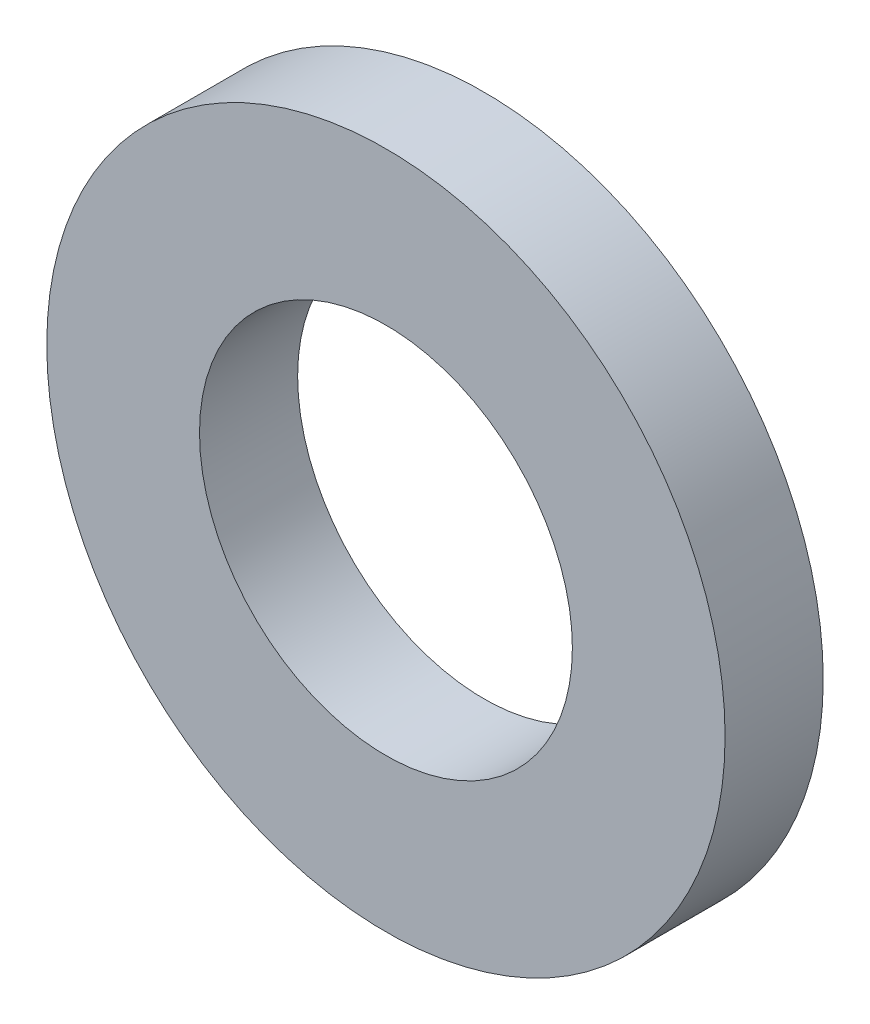
ISO-10303-21;
HEADER;
FILE_DESCRIPTION(('STEP AP214'),'2;1');
FILE_NAME('part.step','',(''),(''),'','','');
FILE_SCHEMA(('AUTOMOTIVE_DESIGN { 1 0 10303 214 1 1 1 1 }'));
ENDSEC;
DATA;
#1=APPLICATION_CONTEXT('core data for automotive mechanical design processes');
#2=APPLICATION_PROTOCOL_DEFINITION('international standard','automotive_design',2000,#1);
#3=PRODUCT_CONTEXT('',#1,'mechanical');
#4=PRODUCT('Part','Part','',(#3));
#5=PRODUCT_RELATED_PRODUCT_CATEGORY('part','',(#4));
#6=PRODUCT_DEFINITION_FORMATION('','',#4);
#7=PRODUCT_DEFINITION_CONTEXT('part definition',#1,'design');
#8=PRODUCT_DEFINITION('design','',#6,#7);
#9=PRODUCT_DEFINITION_SHAPE('','',#8);
#10=(LENGTH_UNIT() NAMED_UNIT(*) SI_UNIT(.MILLI.,.METRE.));
#11=(NAMED_UNIT(*) PLANE_ANGLE_UNIT() SI_UNIT($,.RADIAN.));
#12=(NAMED_UNIT(*) SI_UNIT($,.STERADIAN.) SOLID_ANGLE_UNIT());
#13=UNCERTAINTY_MEASURE_WITH_UNIT(LENGTH_MEASURE(1.E-05),#10,'distance_accuracy_value','');
#14=(GEOMETRIC_REPRESENTATION_CONTEXT(3) GLOBAL_UNCERTAINTY_ASSIGNED_CONTEXT((#13)) GLOBAL_UNIT_ASSIGNED_CONTEXT((#10,
#11,#12)) REPRESENTATION_CONTEXT('',''));
#15=CARTESIAN_POINT('',(0.,0.,0.));
#16=DIRECTION('',(0.,0.,1.));
#17=DIRECTION('',(1.,0.,0.));
#18=AXIS2_PLACEMENT_3D('',#15,#16,#17);
#19=CARTESIAN_POINT('',(0.,0.,1.));
#20=DIRECTION('',(0.,0.,1.));
#21=DIRECTION('',(1.,0.,0.));
#22=AXIS2_PLACEMENT_3D('',#19,#20,#21);
#23=PLANE('',#22);
#24=CARTESIAN_POINT('',(0.,0.,1.));
#25=DIRECTION('',(0.,0.,1.));
#26=DIRECTION('',(1.,0.,0.));
#27=AXIS2_PLACEMENT_3D('',#24,#25,#26);
#28=CIRCLE('',#27,3.45648215711929);
#29=CARTESIAN_POINT('',(3.45648215711929,0.,1.));
#30=VERTEX_POINT('',#29);
#31=EDGE_CURVE('E10',#30,#30,#28,.T.);
#32=ORIENTED_EDGE('',*,*,#31,.T.);
#33=EDGE_LOOP('',(#32));
#34=FACE_BOUND('',#33,.T.);
#35=CARTESIAN_POINT('',(0.,0.,1.));
#36=DIRECTION('',(0.,0.,1.));
#37=DIRECTION('',(1.,0.,0.));
#38=AXIS2_PLACEMENT_3D('',#35,#36,#37);
#39=CIRCLE('',#38,1.9);
#40=CARTESIAN_POINT('',(1.9,0.,1.));
#41=VERTEX_POINT('',#40);
#42=EDGE_CURVE('E46',#41,#41,#39,.T.);
#43=ORIENTED_EDGE('',*,*,#42,.F.);
#44=EDGE_LOOP('',(#43));
#45=FACE_BOUND('',#44,.T.);
#46=ADVANCED_FACE('F35',(#34,#45),#23,.T.);
#47=CARTESIAN_POINT('',(0.,0.,0.));
#48=DIRECTION('',(0.,0.,1.));
#49=DIRECTION('',(1.,0.,0.));
#50=AXIS2_PLACEMENT_3D('',#47,#48,#49);
#51=PLANE('',#50);
#52=CARTESIAN_POINT('',(0.,0.,0.));
#53=DIRECTION('',(0.,0.,1.));
#54=DIRECTION('',(1.,0.,0.));
#55=AXIS2_PLACEMENT_3D('',#52,#53,#54);
#56=CIRCLE('',#55,3.45648215711929);
#57=CARTESIAN_POINT('',(3.45648215711929,0.,0.));
#58=VERTEX_POINT('',#57);
#59=EDGE_CURVE('E39',#58,#58,#56,.T.);
#60=ORIENTED_EDGE('',*,*,#59,.F.);
#61=EDGE_LOOP('',(#60));
#62=FACE_BOUND('',#61,.T.);
#63=CARTESIAN_POINT('',(0.,0.,0.));
#64=DIRECTION('',(0.,0.,1.));
#65=DIRECTION('',(1.,0.,0.));
#66=AXIS2_PLACEMENT_3D('',#63,#64,#65);
#67=CIRCLE('',#66,1.9);
#68=CARTESIAN_POINT('',(1.9,0.,0.));
#69=VERTEX_POINT('',#68);
#70=EDGE_CURVE('E48',#69,#69,#67,.T.);
#71=ORIENTED_EDGE('',*,*,#70,.T.);
#72=EDGE_LOOP('',(#71));
#73=FACE_BOUND('',#72,.T.);
#74=ADVANCED_FACE('F58',(#62,#73),#51,.F.);
#75=CARTESIAN_POINT('',(0.,0.,1.));
#76=DIRECTION('',(0.,0.,-1.));
#77=DIRECTION('',(-1.,0.,0.));
#78=AXIS2_PLACEMENT_3D('',#75,#76,#77);
#79=CYLINDRICAL_SURFACE('',#78,3.45648215711929);
#80=ORIENTED_EDGE('',*,*,#31,.F.);
#81=EDGE_LOOP('',(#80));
#82=FACE_BOUND('',#81,.T.);
#83=ORIENTED_EDGE('',*,*,#59,.T.);
#84=EDGE_LOOP('',(#83));
#85=FACE_BOUND('',#84,.T.);
#86=ADVANCED_FACE('F37',(#82,#85),#79,.T.);
#87=CARTESIAN_POINT('',(0.,0.,1.));
#88=DIRECTION('',(0.,0.,-1.));
#89=DIRECTION('',(-1.,0.,0.));
#90=AXIS2_PLACEMENT_3D('',#87,#88,#89);
#91=CYLINDRICAL_SURFACE('',#90,1.9);
#92=ORIENTED_EDGE('',*,*,#42,.T.);
#93=EDGE_LOOP('',(#92));
#94=FACE_BOUND('',#93,.T.);
#95=ORIENTED_EDGE('',*,*,#70,.F.);
#96=EDGE_LOOP('',(#95));
#97=FACE_BOUND('',#96,.T.);
#98=ADVANCED_FACE('F54',(#94,#97),#91,.F.);
#99=CLOSED_SHELL('',(#46,#74,#86,#98));
#100=MANIFOLD_SOLID_BREP('B2',#99);
#101=ADVANCED_BREP_SHAPE_REPRESENTATION('',(#18,#100),#14);
#102=SHAPE_DEFINITION_REPRESENTATION(#9,#101);
ENDSEC;
END-ISO-10303-21;
